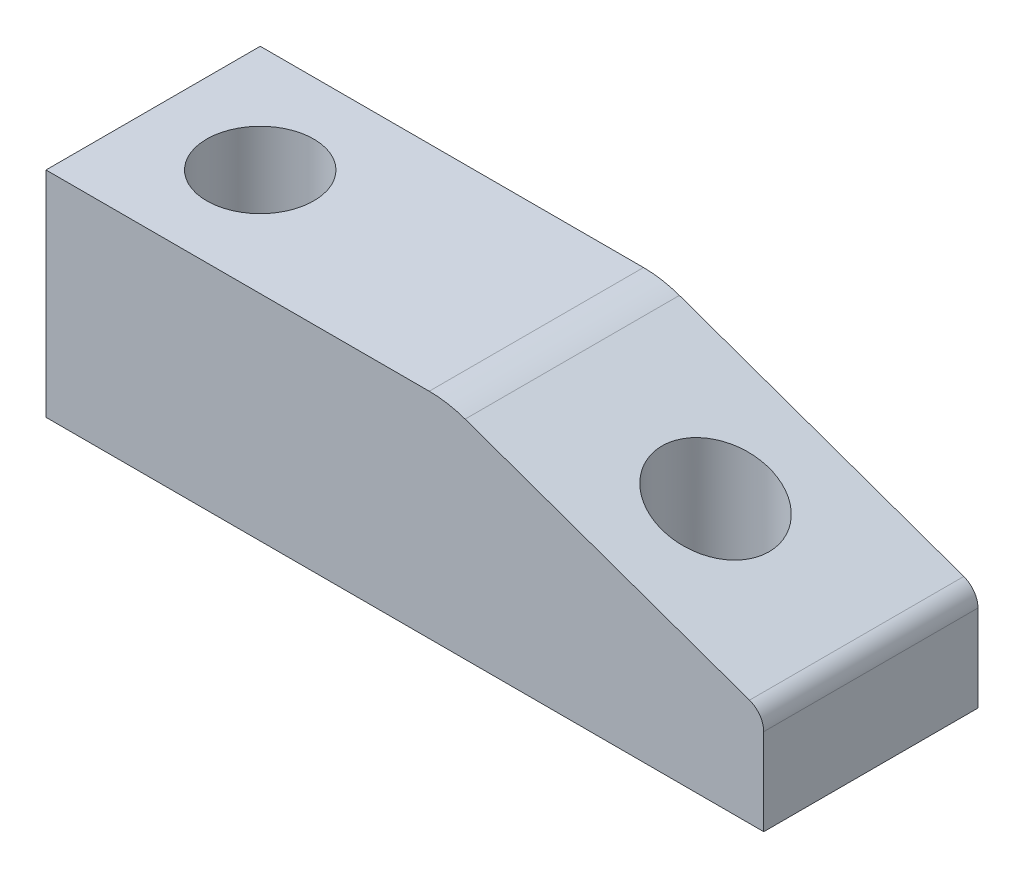
ISO-10303-21;
HEADER;
FILE_DESCRIPTION(('STEP AP214'),'2;1');
FILE_NAME('part.step','',(''),(''),'','','');
FILE_SCHEMA(('AUTOMOTIVE_DESIGN { 1 0 10303 214 1 1 1 1 }'));
ENDSEC;
DATA;
#1=APPLICATION_CONTEXT('core data for automotive mechanical design processes');
#2=APPLICATION_PROTOCOL_DEFINITION('international standard','automotive_design',2000,#1);
#3=PRODUCT_CONTEXT('',#1,'mechanical');
#4=PRODUCT('Part','Part','',(#3));
#5=PRODUCT_RELATED_PRODUCT_CATEGORY('part','',(#4));
#6=PRODUCT_DEFINITION_FORMATION('','',#4);
#7=PRODUCT_DEFINITION_CONTEXT('part definition',#1,'design');
#8=PRODUCT_DEFINITION('design','',#6,#7);
#9=PRODUCT_DEFINITION_SHAPE('','',#8);
#10=(LENGTH_UNIT() NAMED_UNIT(*) SI_UNIT(.MILLI.,.METRE.));
#11=(NAMED_UNIT(*) PLANE_ANGLE_UNIT() SI_UNIT($,.RADIAN.));
#12=(NAMED_UNIT(*) SI_UNIT($,.STERADIAN.) SOLID_ANGLE_UNIT());
#13=UNCERTAINTY_MEASURE_WITH_UNIT(LENGTH_MEASURE(1.E-05),#10,'distance_accuracy_value','');
#14=(GEOMETRIC_REPRESENTATION_CONTEXT(3) GLOBAL_UNCERTAINTY_ASSIGNED_CONTEXT((#13)) GLOBAL_UNIT_ASSIGNED_CONTEXT((#10,
#11,#12)) REPRESENTATION_CONTEXT('',''));
#15=CARTESIAN_POINT('',(0.,0.,0.));
#16=DIRECTION('',(0.,0.,1.));
#17=DIRECTION('',(1.,0.,0.));
#18=AXIS2_PLACEMENT_3D('',#15,#16,#17);
#19=CARTESIAN_POINT('',(-7.7933581661123,-28.6938381251069,-20.));
#20=DIRECTION('',(0.,1.,0.));
#21=DIRECTION('',(-1.,0.,0.));
#22=AXIS2_PLACEMENT_3D('',#19,#20,#21);
#23=CYLINDRICAL_SURFACE('',#22,6.);
#24=CARTESIAN_POINT('',(-7.7933581661123,-11.7232753766298,-20.));
#25=DIRECTION('',(0.,-1.,0.));
#26=DIRECTION('',(0.,0.,-1.));
#27=AXIS2_PLACEMENT_3D('',#24,#25,#26);
#28=CIRCLE('',#27,6.);
#29=CARTESIAN_POINT('',(-7.7933581661123,-11.7232753766298,-26.));
#30=VERTEX_POINT('',#29);
#31=EDGE_CURVE('E171',#30,#30,#28,.F.);
#32=ORIENTED_EDGE('',*,*,#31,.F.);
#33=EDGE_LOOP('',(#32));
#34=FACE_BOUND('',#33,.T.);
#35=CARTESIAN_POINT('',(-7.7933581661123,-0.723275376629771,-20.));
#36=DIRECTION('',(0.,1.,0.));
#37=DIRECTION('',(-1.,0.,0.));
#38=AXIS2_PLACEMENT_3D('',#35,#36,#37);
#39=CIRCLE('',#38,6.);
#40=CARTESIAN_POINT('',(-13.7933581661123,-0.723275376629772,-20.));
#41=VERTEX_POINT('',#40);
#42=EDGE_CURVE('E165',#41,#41,#39,.F.);
#43=ORIENTED_EDGE('',*,*,#42,.F.);
#44=EDGE_LOOP('',(#43));
#45=FACE_BOUND('',#44,.T.);
#46=ADVANCED_FACE('F43',(#34,#45),#23,.F.);
#47=CARTESIAN_POINT('',(77.2066418338877,-28.6938381251069,-20.));
#48=DIRECTION('',(0.,1.,0.));
#49=DIRECTION('',(-1.,0.,0.));
#50=AXIS2_PLACEMENT_3D('',#47,#48,#49);
#51=CYLINDRICAL_SURFACE('',#50,6.);
#52=CARTESIAN_POINT('',(77.2066418338877,-11.7232753766298,-20.));
#53=DIRECTION('',(0.,-1.,0.));
#54=DIRECTION('',(0.,0.,-1.));
#55=AXIS2_PLACEMENT_3D('',#52,#53,#54);
#56=CIRCLE('',#55,6.);
#57=CARTESIAN_POINT('',(77.2066418338877,-11.7232753766298,-26.));
#58=VERTEX_POINT('',#57);
#59=EDGE_CURVE('E140',#58,#58,#56,.F.);
#60=ORIENTED_EDGE('',*,*,#59,.F.);
#61=EDGE_LOOP('',(#60));
#62=FACE_BOUND('',#61,.T.);
#63=CARTESIAN_POINT('',(77.2066418338877,-0.723275376629768,-20.));
#64=DIRECTION('',(0.,1.,0.));
#65=DIRECTION('',(-1.,0.,0.));
#66=AXIS2_PLACEMENT_3D('',#63,#64,#65);
#67=CIRCLE('',#66,6.);
#68=CARTESIAN_POINT('',(71.2066418338877,-0.723275376629768,-20.));
#69=VERTEX_POINT('',#68);
#70=EDGE_CURVE('E163',#69,#69,#67,.F.);
#71=ORIENTED_EDGE('',*,*,#70,.F.);
#72=EDGE_LOOP('',(#71));
#73=FACE_BOUND('',#72,.T.);
#74=ADVANCED_FACE('F203',(#62,#73),#51,.F.);
#75=CARTESIAN_POINT('',(43.7534292173117,28.2767246233702,-40.));
#76=DIRECTION('',(0.,1.,0.));
#77=DIRECTION('',(-1.,0.,0.));
#78=AXIS2_PLACEMENT_3D('',#75,#76,#77);
#79=PLANE('',#78);
#80=CARTESIAN_POINT('',(-7.79335816611231,28.2767246233702,-20.));
#81=DIRECTION('',(0.,1.,0.));
#82=DIRECTION('',(-1.,0.,0.));
#83=AXIS2_PLACEMENT_3D('',#80,#81,#82);
#84=CIRCLE('',#83,10.);
#85=CARTESIAN_POINT('',(-17.7933581661123,28.2767246233702,-20.));
#86=VERTEX_POINT('',#85);
#87=EDGE_CURVE('E245',#86,#86,#84,.T.);
#88=ORIENTED_EDGE('',*,*,#87,.F.);
#89=EDGE_LOOP('',(#88));
#90=FACE_BOUND('',#89,.T.);
#91=DIRECTION('',(-1.,0.,0.));
#92=VECTOR('',#91,1.);
#93=CARTESIAN_POINT('',(43.7534292173117,28.2767246233702,0.));
#94=LINE('',#93,#92);
#95=CARTESIAN_POINT('',(43.7534292173117,28.2767246233702,0.));
#96=VERTEX_POINT('',#95);
#97=CARTESIAN_POINT('',(-27.7933581661123,28.2767246233702,0.));
#98=VERTEX_POINT('',#97);
#99=EDGE_CURVE('E136',#96,#98,#94,.T.);
#100=ORIENTED_EDGE('',*,*,#99,.F.);
#101=DIRECTION('',(0.,0.,1.));
#102=VECTOR('',#101,1.);
#103=CARTESIAN_POINT('',(43.7534292173117,28.2767246233702,-40.));
#104=LINE('',#103,#102);
#105=CARTESIAN_POINT('',(43.7534292173117,28.2767246233702,-40.));
#106=VERTEX_POINT('',#105);
#107=EDGE_CURVE('E12',#106,#96,#104,.T.);
#108=ORIENTED_EDGE('',*,*,#107,.F.);
#109=DIRECTION('',(-1.,0.,0.));
#110=VECTOR('',#109,1.);
#111=CARTESIAN_POINT('',(43.7534292173117,28.2767246233702,-40.));
#112=LINE('',#111,#110);
#113=CARTESIAN_POINT('',(-27.7933581661123,28.2767246233702,-40.));
#114=VERTEX_POINT('',#113);
#115=EDGE_CURVE('E154',#106,#114,#112,.T.);
#116=ORIENTED_EDGE('',*,*,#115,.T.);
#117=DIRECTION('',(0.,0.,1.));
#118=VECTOR('',#117,1.);
#119=CARTESIAN_POINT('',(-27.7933581661123,28.2767246233702,-40.));
#120=LINE('',#119,#118);
#121=EDGE_CURVE('E97',#114,#98,#120,.T.);
#122=ORIENTED_EDGE('',*,*,#121,.T.);
#123=EDGE_LOOP('',(#100,#108,#116,#122));
#124=FACE_BOUND('',#123,.T.);
#125=ADVANCED_FACE('F45',(#90,#124),#79,.T.);
#126=CARTESIAN_POINT('',(43.7534292173118,8.27672462337024,-40.));
#127=DIRECTION('',(0.,0.,1.));
#128=DIRECTION('',(1.,0.,0.));
#129=AXIS2_PLACEMENT_3D('',#126,#127,#128);
#130=CYLINDRICAL_SURFACE('',#129,20.);
#131=CARTESIAN_POINT('',(43.7534292173118,8.27672462337024,0.));
#132=DIRECTION('',(0.,0.,1.));
#133=DIRECTION('',(-1.,0.,0.));
#134=AXIS2_PLACEMENT_3D('',#131,#132,#133);
#135=CIRCLE('',#134,20.);
#136=CARTESIAN_POINT('',(50.4599225278447,27.1187772577245,0.));
#137=VERTEX_POINT('',#136);
#138=EDGE_CURVE('E152',#137,#96,#135,.T.);
#139=ORIENTED_EDGE('',*,*,#138,.F.);
#140=DIRECTION('',(0.,0.,1.));
#141=VECTOR('',#140,1.);
#142=CARTESIAN_POINT('',(50.4599225278447,27.1187772577245,-40.));
#143=LINE('',#142,#141);
#144=CARTESIAN_POINT('',(50.4599225278447,27.1187772577245,-40.));
#145=VERTEX_POINT('',#144);
#146=EDGE_CURVE('E53',#145,#137,#143,.T.);
#147=ORIENTED_EDGE('',*,*,#146,.F.);
#148=CARTESIAN_POINT('',(43.7534292173118,8.27672462337024,-40.));
#149=DIRECTION('',(0.,0.,1.));
#150=DIRECTION('',(-1.,0.,0.));
#151=AXIS2_PLACEMENT_3D('',#148,#149,#150);
#152=CIRCLE('',#151,20.);
#153=EDGE_CURVE('E126',#145,#106,#152,.T.);
#154=ORIENTED_EDGE('',*,*,#153,.T.);
#155=ORIENTED_EDGE('',*,*,#107,.T.);
#156=EDGE_LOOP('',(#139,#147,#154,#155));
#157=FACE_BOUND('',#156,.T.);
#158=ADVANCED_FACE('F193',(#157),#130,.T.);
#159=CARTESIAN_POINT('',(103.547940495994,8.22304204872213,-40.));
#160=DIRECTION('',(0.335324665526644,0.942102631717715,0.));
#161=DIRECTION('',(-0.942102631717715,0.335324665526644,0.));
#162=AXIS2_PLACEMENT_3D('',#159,#160,#161);
#163=PLANE('',#162);
#164=CARTESIAN_POINT('',(77.2066418338877,17.5987585216753,-20.));
#165=DIRECTION('',(0.335324665526644,0.942102631717715,0.));
#166=DIRECTION('',(-0.942102631717715,0.335324665526644,0.));
#167=AXIS2_PLACEMENT_3D('',#164,#165,#166);
#168=ELLIPSE('',#167,10.6145547876957,9.99999999999999);
#169=CARTESIAN_POINT('',(67.2066418338877,21.1580805555736,-20.));
#170=VERTEX_POINT('',#169);
#171=EDGE_CURVE('E47',#170,#170,#168,.T.);
#172=ORIENTED_EDGE('',*,*,#171,.F.);
#173=EDGE_LOOP('',(#172));
#174=FACE_BOUND('',#173,.T.);
#175=DIRECTION('',(-0.942102631717715,0.335324665526644,0.));
#176=VECTOR('',#175,1.);
#177=CARTESIAN_POINT('',(103.547940495994,8.22304204872213,0.));
#178=LINE('',#177,#176);
#179=CARTESIAN_POINT('',(103.547940495994,8.22304204872213,0.));
#180=VERTEX_POINT('',#179);
#181=EDGE_CURVE('E113',#180,#137,#178,.T.);
#182=ORIENTED_EDGE('',*,*,#181,.F.);
#183=DIRECTION('',(0.,0.,1.));
#184=VECTOR('',#183,1.);
#185=CARTESIAN_POINT('',(103.547940495994,8.22304204872213,-40.));
#186=LINE('',#185,#184);
#187=CARTESIAN_POINT('',(103.547940495994,8.22304204872213,-40.));
#188=VERTEX_POINT('',#187);
#189=EDGE_CURVE('E108',#188,#180,#186,.T.);
#190=ORIENTED_EDGE('',*,*,#189,.F.);
#191=DIRECTION('',(-0.942102631717715,0.335324665526644,0.));
#192=VECTOR('',#191,1.);
#193=CARTESIAN_POINT('',(103.547940495994,8.22304204872213,-40.));
#194=LINE('',#193,#192);
#195=EDGE_CURVE('E111',#188,#145,#194,.T.);
#196=ORIENTED_EDGE('',*,*,#195,.T.);
#197=ORIENTED_EDGE('',*,*,#146,.T.);
#198=EDGE_LOOP('',(#182,#190,#196,#197));
#199=FACE_BOUND('',#198,.T.);
#200=ADVANCED_FACE('F110',(#174,#199),#163,.T.);
#201=CARTESIAN_POINT('',(102.206641833888,4.45463152185126,-40.));
#202=DIRECTION('',(0.,0.,1.));
#203=DIRECTION('',(1.,0.,0.));
#204=AXIS2_PLACEMENT_3D('',#201,#202,#203);
#205=CYLINDRICAL_SURFACE('',#204,4.);
#206=CARTESIAN_POINT('',(102.206641833888,4.45463152185126,0.));
#207=DIRECTION('',(0.,0.,1.));
#208=DIRECTION('',(1.,0.,0.));
#209=AXIS2_PLACEMENT_3D('',#206,#207,#208);
#210=CIRCLE('',#209,4.);
#211=CARTESIAN_POINT('',(106.206641833888,4.45463152185124,0.));
#212=VERTEX_POINT('',#211);
#213=EDGE_CURVE('E149',#212,#180,#210,.T.);
#214=ORIENTED_EDGE('',*,*,#213,.F.);
#215=DIRECTION('',(0.,0.,1.));
#216=VECTOR('',#215,1.);
#217=CARTESIAN_POINT('',(106.206641833888,4.45463152185124,-40.));
#218=LINE('',#217,#216);
#219=CARTESIAN_POINT('',(106.206641833888,4.45463152185124,-40.));
#220=VERTEX_POINT('',#219);
#221=EDGE_CURVE('E118',#220,#212,#218,.T.);
#222=ORIENTED_EDGE('',*,*,#221,.F.);
#223=CARTESIAN_POINT('',(102.206641833888,4.45463152185126,-40.));
#224=DIRECTION('',(0.,0.,1.));
#225=DIRECTION('',(1.,0.,0.));
#226=AXIS2_PLACEMENT_3D('',#223,#224,#225);
#227=CIRCLE('',#226,4.);
#228=EDGE_CURVE('E124',#220,#188,#227,.T.);
#229=ORIENTED_EDGE('',*,*,#228,.T.);
#230=ORIENTED_EDGE('',*,*,#189,.T.);
#231=EDGE_LOOP('',(#214,#222,#229,#230));
#232=FACE_BOUND('',#231,.T.);
#233=ADVANCED_FACE('F128',(#232),#205,.T.);
#234=CARTESIAN_POINT('',(106.206641833888,-11.7232753766298,-40.));
#235=DIRECTION('',(1.,0.,0.));
#236=DIRECTION('',(0.,0.,-1.));
#237=AXIS2_PLACEMENT_3D('',#234,#235,#236);
#238=PLANE('',#237);
#239=DIRECTION('',(0.,1.,0.));
#240=VECTOR('',#239,1.);
#241=CARTESIAN_POINT('',(106.206641833888,-11.7232753766298,0.));
#242=LINE('',#241,#240);
#243=CARTESIAN_POINT('',(106.206641833888,-11.7232753766298,0.));
#244=VERTEX_POINT('',#243);
#245=EDGE_CURVE('E146',#244,#212,#242,.T.);
#246=ORIENTED_EDGE('',*,*,#245,.F.);
#247=DIRECTION('',(0.,0.,1.));
#248=VECTOR('',#247,1.);
#249=CARTESIAN_POINT('',(106.206641833888,-11.7232753766298,-40.));
#250=LINE('',#249,#248);
#251=CARTESIAN_POINT('',(106.206641833888,-11.7232753766298,-40.));
#252=VERTEX_POINT('',#251);
#253=EDGE_CURVE('E158',#252,#244,#250,.T.);
#254=ORIENTED_EDGE('',*,*,#253,.F.);
#255=DIRECTION('',(0.,1.,0.));
#256=VECTOR('',#255,1.);
#257=CARTESIAN_POINT('',(106.206641833888,-11.7232753766298,-40.));
#258=LINE('',#257,#256);
#259=EDGE_CURVE('E129',#252,#220,#258,.T.);
#260=ORIENTED_EDGE('',*,*,#259,.T.);
#261=ORIENTED_EDGE('',*,*,#221,.T.);
#262=EDGE_LOOP('',(#246,#254,#260,#261));
#263=FACE_BOUND('',#262,.T.);
#264=ADVANCED_FACE('F302',(#263),#238,.T.);
#265=CARTESIAN_POINT('',(-27.7933581661123,-11.7232753766298,-40.));
#266=DIRECTION('',(0.,-1.,0.));
#267=DIRECTION('',(0.,0.,-1.));
#268=AXIS2_PLACEMENT_3D('',#265,#266,#267);
#269=PLANE('',#268);
#270=ORIENTED_EDGE('',*,*,#59,.T.);
#271=EDGE_LOOP('',(#270));
#272=FACE_BOUND('',#271,.T.);
#273=ORIENTED_EDGE('',*,*,#31,.T.);
#274=EDGE_LOOP('',(#273));
#275=FACE_BOUND('',#274,.T.);
#276=DIRECTION('',(1.,0.,0.));
#277=VECTOR('',#276,1.);
#278=CARTESIAN_POINT('',(-27.7933581661123,-11.7232753766298,0.));
#279=LINE('',#278,#277);
#280=CARTESIAN_POINT('',(-27.7933581661123,-11.7232753766298,0.));
#281=VERTEX_POINT('',#280);
#282=EDGE_CURVE('E143',#281,#244,#279,.T.);
#283=ORIENTED_EDGE('',*,*,#282,.F.);
#284=DIRECTION('',(0.,0.,1.));
#285=VECTOR('',#284,1.);
#286=CARTESIAN_POINT('',(-27.7933581661123,-11.7232753766298,-40.));
#287=LINE('',#286,#285);
#288=CARTESIAN_POINT('',(-27.7933581661123,-11.7232753766298,-40.));
#289=VERTEX_POINT('',#288);
#290=EDGE_CURVE('E160',#289,#281,#287,.T.);
#291=ORIENTED_EDGE('',*,*,#290,.F.);
#292=DIRECTION('',(1.,0.,0.));
#293=VECTOR('',#292,1.);
#294=CARTESIAN_POINT('',(-27.7933581661123,-11.7232753766298,-40.));
#295=LINE('',#294,#293);
#296=EDGE_CURVE('E131',#289,#252,#295,.T.);
#297=ORIENTED_EDGE('',*,*,#296,.T.);
#298=ORIENTED_EDGE('',*,*,#253,.T.);
#299=EDGE_LOOP('',(#283,#291,#297,#298));
#300=FACE_BOUND('',#299,.T.);
#301=ADVANCED_FACE('F188',(#272,#275,#300),#269,.T.);
#302=CARTESIAN_POINT('',(-27.7933581661123,28.2767246233702,-40.));
#303=DIRECTION('',(-1.,0.,0.));
#304=DIRECTION('',(0.,-1.,0.));
#305=AXIS2_PLACEMENT_3D('',#302,#303,#304);
#306=PLANE('',#305);
#307=DIRECTION('',(0.,-1.,0.));
#308=VECTOR('',#307,1.);
#309=CARTESIAN_POINT('',(-27.7933581661123,28.2767246233702,0.));
#310=LINE('',#309,#308);
#311=EDGE_CURVE('E139',#98,#281,#310,.T.);
#312=ORIENTED_EDGE('',*,*,#311,.F.);
#313=ORIENTED_EDGE('',*,*,#121,.F.);
#314=DIRECTION('',(0.,-1.,0.));
#315=VECTOR('',#314,1.);
#316=CARTESIAN_POINT('',(-27.7933581661123,28.2767246233702,-40.));
#317=LINE('',#316,#315);
#318=EDGE_CURVE('E183',#114,#289,#317,.T.);
#319=ORIENTED_EDGE('',*,*,#318,.T.);
#320=ORIENTED_EDGE('',*,*,#290,.T.);
#321=EDGE_LOOP('',(#312,#313,#319,#320));
#322=FACE_BOUND('',#321,.T.);
#323=ADVANCED_FACE('F190',(#322),#306,.T.);
#324=CARTESIAN_POINT('',(102.206641833888,4.45463152185126,-40.));
#325=DIRECTION('',(0.,0.,1.));
#326=DIRECTION('',(1.,0.,0.));
#327=AXIS2_PLACEMENT_3D('',#324,#325,#326);
#328=PLANE('',#327);
#329=ORIENTED_EDGE('',*,*,#115,.F.);
#330=ORIENTED_EDGE('',*,*,#153,.F.);
#331=ORIENTED_EDGE('',*,*,#195,.F.);
#332=ORIENTED_EDGE('',*,*,#228,.F.);
#333=ORIENTED_EDGE('',*,*,#259,.F.);
#334=ORIENTED_EDGE('',*,*,#296,.F.);
#335=ORIENTED_EDGE('',*,*,#318,.F.);
#336=EDGE_LOOP('',(#329,#330,#331,#332,#333,#334,#335));
#337=FACE_BOUND('',#336,.T.);
#338=ADVANCED_FACE('F122',(#337),#328,.F.);
#339=CARTESIAN_POINT('',(102.206641833888,4.45463152185126,0.));
#340=DIRECTION('',(0.,0.,1.));
#341=DIRECTION('',(1.,0.,0.));
#342=AXIS2_PLACEMENT_3D('',#339,#340,#341);
#343=PLANE('',#342);
#344=ORIENTED_EDGE('',*,*,#99,.T.);
#345=ORIENTED_EDGE('',*,*,#311,.T.);
#346=ORIENTED_EDGE('',*,*,#282,.T.);
#347=ORIENTED_EDGE('',*,*,#245,.T.);
#348=ORIENTED_EDGE('',*,*,#213,.T.);
#349=ORIENTED_EDGE('',*,*,#181,.T.);
#350=ORIENTED_EDGE('',*,*,#138,.T.);
#351=EDGE_LOOP('',(#344,#345,#346,#347,#348,#349,#350));
#352=FACE_BOUND('',#351,.T.);
#353=ADVANCED_FACE('F192',(#352),#343,.T.);
#354=CARTESIAN_POINT('',(77.2066418338877,-0.723275376629768,-20.));
#355=DIRECTION('',(0.,1.,0.));
#356=DIRECTION('',(-1.,0.,0.));
#357=AXIS2_PLACEMENT_3D('',#354,#355,#356);
#358=PLANE('',#357);
#359=CARTESIAN_POINT('',(77.2066418338877,-0.723275376629768,-20.));
#360=DIRECTION('',(0.,1.,0.));
#361=DIRECTION('',(-1.,0.,0.));
#362=AXIS2_PLACEMENT_3D('',#359,#360,#361);
#363=CIRCLE('',#362,9.99999999999999);
#364=CARTESIAN_POINT('',(67.2066418338877,-0.723275376629768,-20.));
#365=VERTEX_POINT('',#364);
#366=EDGE_CURVE('E166',#365,#365,#363,.T.);
#367=ORIENTED_EDGE('',*,*,#366,.T.);
#368=EDGE_LOOP('',(#367));
#369=FACE_BOUND('',#368,.T.);
#370=ORIENTED_EDGE('',*,*,#70,.T.);
#371=EDGE_LOOP('',(#370));
#372=FACE_BOUND('',#371,.T.);
#373=ADVANCED_FACE('F220',(#369,#372),#358,.T.);
#374=CARTESIAN_POINT('',(77.2066418338877,-0.723275376629768,-20.));
#375=DIRECTION('',(0.,1.,0.));
#376=DIRECTION('',(-1.,0.,0.));
#377=AXIS2_PLACEMENT_3D('',#374,#375,#376);
#378=CYLINDRICAL_SURFACE('',#377,9.99999999999999);
#379=ORIENTED_EDGE('',*,*,#171,.T.);
#380=EDGE_LOOP('',(#379));
#381=FACE_BOUND('',#380,.T.);
#382=ORIENTED_EDGE('',*,*,#366,.F.);
#383=EDGE_LOOP('',(#382));
#384=FACE_BOUND('',#383,.T.);
#385=ADVANCED_FACE('F224',(#381,#384),#378,.F.);
#386=CARTESIAN_POINT('',(-7.7933581661123,-0.723275376629771,-20.));
#387=DIRECTION('',(0.,1.,0.));
#388=DIRECTION('',(-1.,0.,0.));
#389=AXIS2_PLACEMENT_3D('',#386,#387,#388);
#390=PLANE('',#389);
#391=CARTESIAN_POINT('',(-7.7933581661123,-0.723275376629771,-20.));
#392=DIRECTION('',(0.,1.,0.));
#393=DIRECTION('',(-1.,0.,0.));
#394=AXIS2_PLACEMENT_3D('',#391,#392,#393);
#395=CIRCLE('',#394,10.);
#396=CARTESIAN_POINT('',(-17.7933581661123,-0.723275376629772,-20.));
#397=VERTEX_POINT('',#396);
#398=EDGE_CURVE('E244',#397,#397,#395,.T.);
#399=ORIENTED_EDGE('',*,*,#398,.T.);
#400=EDGE_LOOP('',(#399));
#401=FACE_BOUND('',#400,.T.);
#402=ORIENTED_EDGE('',*,*,#42,.T.);
#403=EDGE_LOOP('',(#402));
#404=FACE_BOUND('',#403,.T.);
#405=ADVANCED_FACE('F230',(#401,#404),#390,.T.);
#406=CARTESIAN_POINT('',(-7.7933581661123,-0.723275376629771,-20.));
#407=DIRECTION('',(0.,1.,0.));
#408=DIRECTION('',(-1.,0.,0.));
#409=AXIS2_PLACEMENT_3D('',#406,#407,#408);
#410=CYLINDRICAL_SURFACE('',#409,10.);
#411=CARTESIAN_POINT('',(-17.7933581661123,-0.723275376629772,-20.));
#412=CARTESIAN_POINT('',(-17.7933581661123,-0.421192043296439,-20.));
#413=CARTESIAN_POINT('',(-17.7933581661123,-0.119108709963105,-20.));
#414=CARTESIAN_POINT('',(-17.7933581661123,0.485057956703561,-20.));
#415=CARTESIAN_POINT('',(-17.7933581661123,0.787141290036895,-20.));
#416=CARTESIAN_POINT('',(-17.7933581661123,1.39130795670356,-20.));
#417=CARTESIAN_POINT('',(-17.7933581661123,1.6933912900369,-20.));
#418=CARTESIAN_POINT('',(-17.7933581661123,2.29755795670356,-20.));
#419=CARTESIAN_POINT('',(-17.7933581661123,2.5996412900369,-20.));
#420=CARTESIAN_POINT('',(-17.7933581661123,3.20380795670356,-20.));
#421=CARTESIAN_POINT('',(-17.7933581661123,3.50589129003689,-20.));
#422=CARTESIAN_POINT('',(-17.7933581661123,4.11005795670356,-20.));
#423=CARTESIAN_POINT('',(-17.7933581661123,4.4121412900369,-20.));
#424=CARTESIAN_POINT('',(-17.7933581661123,5.01630795670356,-20.));
#425=CARTESIAN_POINT('',(-17.7933581661123,5.3183912900369,-20.));
#426=CARTESIAN_POINT('',(-17.7933581661123,5.92255795670356,-20.));
#427=CARTESIAN_POINT('',(-17.7933581661123,6.2246412900369,-20.));
#428=CARTESIAN_POINT('',(-17.7933581661123,6.82880795670356,-20.));
#429=CARTESIAN_POINT('',(-17.7933581661123,7.1308912900369,-20.));
#430=CARTESIAN_POINT('',(-17.7933581661123,7.73505795670356,-20.));
#431=CARTESIAN_POINT('',(-17.7933581661123,8.03714129003689,-20.));
#432=CARTESIAN_POINT('',(-17.7933581661123,8.64130795670356,-20.));
#433=CARTESIAN_POINT('',(-17.7933581661123,8.9433912900369,-20.));
#434=CARTESIAN_POINT('',(-17.7933581661123,9.54755795670356,-20.));
#435=CARTESIAN_POINT('',(-17.7933581661123,9.8496412900369,-20.));
#436=CARTESIAN_POINT('',(-17.7933581661123,10.4538079567036,-20.));
#437=CARTESIAN_POINT('',(-17.7933581661123,10.7558912900369,-20.));
#438=CARTESIAN_POINT('',(-17.7933581661123,11.3600579567036,-20.));
#439=CARTESIAN_POINT('',(-17.7933581661123,11.6621412900369,-20.));
#440=CARTESIAN_POINT('',(-17.7933581661123,12.2663079567036,-20.));
#441=CARTESIAN_POINT('',(-17.7933581661123,12.5683912900369,-20.));
#442=CARTESIAN_POINT('',(-17.7933581661123,13.1725579567036,-20.));
#443=CARTESIAN_POINT('',(-17.7933581661123,13.4746412900369,-20.));
#444=CARTESIAN_POINT('',(-17.7933581661123,14.0788079567036,-20.));
#445=CARTESIAN_POINT('',(-17.7933581661123,14.3808912900369,-20.));
#446=CARTESIAN_POINT('',(-17.7933581661123,14.9850579567036,-20.));
#447=CARTESIAN_POINT('',(-17.7933581661123,15.2871412900369,-20.));
#448=CARTESIAN_POINT('',(-17.7933581661123,15.8913079567036,-20.));
#449=CARTESIAN_POINT('',(-17.7933581661123,16.1933912900369,-20.));
#450=CARTESIAN_POINT('',(-17.7933581661123,16.7975579567036,-20.));
#451=CARTESIAN_POINT('',(-17.7933581661123,17.0996412900369,-20.));
#452=CARTESIAN_POINT('',(-17.7933581661123,17.7038079567036,-20.));
#453=CARTESIAN_POINT('',(-17.7933581661123,18.0058912900369,-20.));
#454=CARTESIAN_POINT('',(-17.7933581661123,18.6100579567036,-20.));
#455=CARTESIAN_POINT('',(-17.7933581661123,18.9121412900369,-20.));
#456=CARTESIAN_POINT('',(-17.7933581661123,19.5163079567036,-20.));
#457=CARTESIAN_POINT('',(-17.7933581661123,19.8183912900369,-20.));
#458=CARTESIAN_POINT('',(-17.7933581661123,20.4225579567036,-20.));
#459=CARTESIAN_POINT('',(-17.7933581661123,20.7246412900369,-20.));
#460=CARTESIAN_POINT('',(-17.7933581661123,21.3288079567036,-20.));
#461=CARTESIAN_POINT('',(-17.7933581661123,21.6308912900369,-20.));
#462=CARTESIAN_POINT('',(-17.7933581661123,22.2350579567036,-20.));
#463=CARTESIAN_POINT('',(-17.7933581661123,22.5371412900369,-20.));
#464=CARTESIAN_POINT('',(-17.7933581661123,23.1413079567036,-20.));
#465=CARTESIAN_POINT('',(-17.7933581661123,23.4433912900369,-20.));
#466=CARTESIAN_POINT('',(-17.7933581661123,24.0475579567036,-20.));
#467=CARTESIAN_POINT('',(-17.7933581661123,24.3496412900369,-20.));
#468=CARTESIAN_POINT('',(-17.7933581661123,24.9538079567036,-20.));
#469=CARTESIAN_POINT('',(-17.7933581661123,25.2558912900369,-20.));
#470=CARTESIAN_POINT('',(-17.7933581661123,25.8600579567036,-20.));
#471=CARTESIAN_POINT('',(-17.7933581661123,26.1621412900369,-20.));
#472=CARTESIAN_POINT('',(-17.7933581661123,26.7663079567036,-20.));
#473=CARTESIAN_POINT('',(-17.7933581661123,27.0683912900369,-20.));
#474=CARTESIAN_POINT('',(-17.7933581661123,27.6725579567036,-20.));
#475=CARTESIAN_POINT('',(-17.7933581661123,27.9746412900369,-20.));
#476=CARTESIAN_POINT('',(-17.7933581661123,28.2767246233702,-20.));
#477=B_SPLINE_CURVE_WITH_KNOTS('',3,(#411,#412,#413,#414,#415,#416,#417,#418,#419,#420,#421,
#422,#423,#424,#425,#426,#427,#428,#429,#430,#431,#432,#433,#434,#435,#436,#437,#438,#439,#440,
#441,#442,#443,#444,#445,#446,#447,#448,#449,#450,#451,#452,#453,#454,#455,#456,#457,#458,#459,
#460,#461,#462,#463,#464,#465,#466,#467,#468,#469,#470,#471,#472,#473,#474,#475,#476),
.UNSPECIFIED.,.F.,.F.,(4,2,2,2,2,2,2,2,2,2,2,2,2,2,2,2,2,2,2,2,2,2,2,2,2,2,2,2,2,2,2,2,4),(0.,
0.90625,1.8125,2.71875,3.625,4.53125,5.4375,6.34375,7.25,8.15625,9.0625,9.96875,10.875,11.78125,
12.6875,13.59375,14.5,15.40625,16.3125,17.21875,18.125,19.03125,19.9375,20.84375,21.75,22.65625,
23.5625,24.46875,25.375,26.28125,27.1875,28.09375,29.),.UNSPECIFIED.);
#478=EDGE_CURVE('BSEAM235',#397,#86,#477,.T.);
#479=ORIENTED_EDGE('',*,*,#398,.F.);
#480=ORIENTED_EDGE('',*,*,#87,.T.);
#481=ORIENTED_EDGE('',*,*,#478,.T.);
#482=ORIENTED_EDGE('',*,*,#478,.F.);
#483=EDGE_LOOP('',(#479,#481,#480,#482));
#484=FACE_BOUND('',#483,.T.);
#485=ADVANCED_FACE('F235',(#484),#410,.F.);
#486=CLOSED_SHELL('',(#46,#74,#125,#158,#200,#233,#264,#301,#323,#338,#353,#373,#385,#405,#485));
#487=MANIFOLD_SOLID_BREP('B2',#486);
#488=ADVANCED_BREP_SHAPE_REPRESENTATION('',(#18,#487),#14);
#489=SHAPE_DEFINITION_REPRESENTATION(#9,#488);
ENDSEC;
END-ISO-10303-21;
